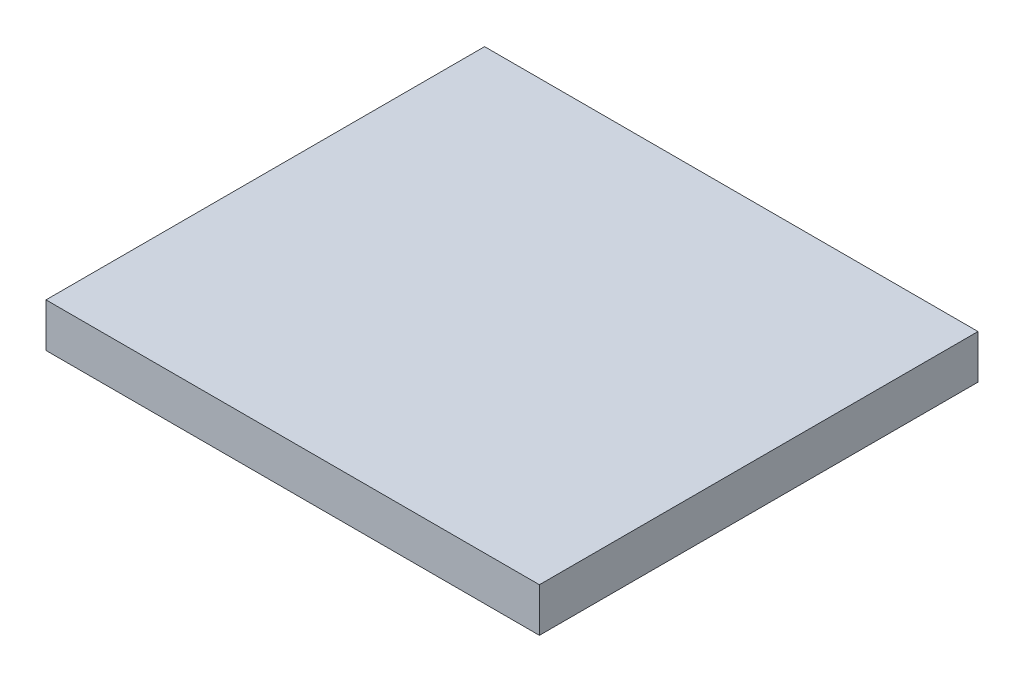
ISO-10303-21;
HEADER;
FILE_DESCRIPTION(('STEP AP214'),'2;1');
FILE_NAME('part.step','',(''),(''),'','','');
FILE_SCHEMA(('AUTOMOTIVE_DESIGN { 1 0 10303 214 1 1 1 1 }'));
ENDSEC;
DATA;
#1=APPLICATION_CONTEXT('core data for automotive mechanical design processes');
#2=APPLICATION_PROTOCOL_DEFINITION('international standard','automotive_design',2000,#1);
#3=PRODUCT_CONTEXT('',#1,'mechanical');
#4=PRODUCT('Part','Part','',(#3));
#5=PRODUCT_RELATED_PRODUCT_CATEGORY('part','',(#4));
#6=PRODUCT_DEFINITION_FORMATION('','',#4);
#7=PRODUCT_DEFINITION_CONTEXT('part definition',#1,'design');
#8=PRODUCT_DEFINITION('design','',#6,#7);
#9=PRODUCT_DEFINITION_SHAPE('','',#8);
#10=(LENGTH_UNIT() NAMED_UNIT(*) SI_UNIT(.MILLI.,.METRE.));
#11=(NAMED_UNIT(*) PLANE_ANGLE_UNIT() SI_UNIT($,.RADIAN.));
#12=(NAMED_UNIT(*) SI_UNIT($,.STERADIAN.) SOLID_ANGLE_UNIT());
#13=UNCERTAINTY_MEASURE_WITH_UNIT(LENGTH_MEASURE(1.E-05),#10,'distance_accuracy_value','');
#14=(GEOMETRIC_REPRESENTATION_CONTEXT(3) GLOBAL_UNCERTAINTY_ASSIGNED_CONTEXT((#13)) GLOBAL_UNIT_ASSIGNED_CONTEXT((#10,
#11,#12)) REPRESENTATION_CONTEXT('',''));
#15=CARTESIAN_POINT('',(0.,0.,0.));
#16=DIRECTION('',(0.,0.,1.));
#17=DIRECTION('',(1.,0.,0.));
#18=AXIS2_PLACEMENT_3D('',#15,#16,#17);
#19=CARTESIAN_POINT('',(0.,0.,0.));
#20=DIRECTION('',(0.,-1.,0.));
#21=DIRECTION('',(0.,0.,-1.));
#22=AXIS2_PLACEMENT_3D('',#19,#20,#21);
#23=PLANE('',#22);
#24=DIRECTION('',(0.,0.,-1.));
#25=VECTOR('',#24,1.);
#26=CARTESIAN_POINT('',(9.,0.,8.));
#27=LINE('',#26,#25);
#28=CARTESIAN_POINT('',(9.,0.,8.));
#29=VERTEX_POINT('',#28);
#30=CARTESIAN_POINT('',(9.,0.,-8.));
#31=VERTEX_POINT('',#30);
#32=EDGE_CURVE('E97',#29,#31,#27,.T.);
#33=ORIENTED_EDGE('',*,*,#32,.F.);
#34=DIRECTION('',(1.,0.,0.));
#35=VECTOR('',#34,1.);
#36=CARTESIAN_POINT('',(-9.,0.,8.));
#37=LINE('',#36,#35);
#38=CARTESIAN_POINT('',(-9.,0.,8.));
#39=VERTEX_POINT('',#38);
#40=EDGE_CURVE('E28',#39,#29,#37,.T.);
#41=ORIENTED_EDGE('',*,*,#40,.F.);
#42=DIRECTION('',(0.,0.,1.));
#43=VECTOR('',#42,1.);
#44=CARTESIAN_POINT('',(-9.,0.,8.));
#45=LINE('',#44,#43);
#46=CARTESIAN_POINT('',(-9.,0.,-8.));
#47=VERTEX_POINT('',#46);
#48=EDGE_CURVE('E67',#47,#39,#45,.T.);
#49=ORIENTED_EDGE('',*,*,#48,.F.);
#50=DIRECTION('',(-1.,0.,0.));
#51=VECTOR('',#50,1.);
#52=CARTESIAN_POINT('',(-9.,0.,-8.));
#53=LINE('',#52,#51);
#54=EDGE_CURVE('E87',#31,#47,#53,.T.);
#55=ORIENTED_EDGE('',*,*,#54,.F.);
#56=EDGE_LOOP('',(#33,#41,#49,#55));
#57=FACE_BOUND('',#56,.T.);
#58=ADVANCED_FACE('F17',(#57),#23,.T.);
#59=CARTESIAN_POINT('',(0.,1.6,0.));
#60=DIRECTION('',(0.,-1.,0.));
#61=DIRECTION('',(0.,0.,-1.));
#62=AXIS2_PLACEMENT_3D('',#59,#60,#61);
#63=PLANE('',#62);
#64=DIRECTION('',(0.,0.,-1.));
#65=VECTOR('',#64,1.);
#66=CARTESIAN_POINT('',(9.,1.6,8.));
#67=LINE('',#66,#65);
#68=CARTESIAN_POINT('',(9.,1.6,8.));
#69=VERTEX_POINT('',#68);
#70=CARTESIAN_POINT('',(9.,1.6,-8.));
#71=VERTEX_POINT('',#70);
#72=EDGE_CURVE('E76',#69,#71,#67,.T.);
#73=ORIENTED_EDGE('',*,*,#72,.T.);
#74=DIRECTION('',(-1.,0.,0.));
#75=VECTOR('',#74,1.);
#76=CARTESIAN_POINT('',(-9.,1.6,-8.));
#77=LINE('',#76,#75);
#78=CARTESIAN_POINT('',(-9.,1.6,-8.));
#79=VERTEX_POINT('',#78);
#80=EDGE_CURVE('E21',#71,#79,#77,.T.);
#81=ORIENTED_EDGE('',*,*,#80,.T.);
#82=DIRECTION('',(0.,0.,1.));
#83=VECTOR('',#82,1.);
#84=CARTESIAN_POINT('',(-9.,1.6,8.));
#85=LINE('',#84,#83);
#86=CARTESIAN_POINT('',(-9.,1.6,8.));
#87=VERTEX_POINT('',#86);
#88=EDGE_CURVE('E78',#79,#87,#85,.T.);
#89=ORIENTED_EDGE('',*,*,#88,.T.);
#90=DIRECTION('',(1.,0.,0.));
#91=VECTOR('',#90,1.);
#92=CARTESIAN_POINT('',(-9.,1.6,8.));
#93=LINE('',#92,#91);
#94=EDGE_CURVE('E11',#87,#69,#93,.T.);
#95=ORIENTED_EDGE('',*,*,#94,.T.);
#96=EDGE_LOOP('',(#73,#81,#89,#95));
#97=FACE_BOUND('',#96,.T.);
#98=ADVANCED_FACE('F73',(#97),#63,.F.);
#99=CARTESIAN_POINT('',(-9.,1.6,8.));
#100=DIRECTION('',(0.,0.,-1.));
#101=DIRECTION('',(0.,-1.,0.));
#102=AXIS2_PLACEMENT_3D('',#99,#100,#101);
#103=PLANE('',#102);
#104=ORIENTED_EDGE('',*,*,#40,.T.);
#105=DIRECTION('',(0.,-1.,0.));
#106=VECTOR('',#105,1.);
#107=CARTESIAN_POINT('',(9.,1.6,8.));
#108=LINE('',#107,#106);
#109=EDGE_CURVE('E81',#69,#29,#108,.T.);
#110=ORIENTED_EDGE('',*,*,#109,.F.);
#111=ORIENTED_EDGE('',*,*,#94,.F.);
#112=DIRECTION('',(0.,-1.,0.));
#113=VECTOR('',#112,1.);
#114=CARTESIAN_POINT('',(-9.,1.6,8.));
#115=LINE('',#114,#113);
#116=EDGE_CURVE('E101',#87,#39,#115,.T.);
#117=ORIENTED_EDGE('',*,*,#116,.T.);
#118=EDGE_LOOP('',(#104,#110,#111,#117));
#119=FACE_BOUND('',#118,.T.);
#120=ADVANCED_FACE('F82',(#119),#103,.F.);
#121=CARTESIAN_POINT('',(-9.,1.6,8.));
#122=DIRECTION('',(1.,0.,0.));
#123=DIRECTION('',(0.,1.,0.));
#124=AXIS2_PLACEMENT_3D('',#121,#122,#123);
#125=PLANE('',#124);
#126=ORIENTED_EDGE('',*,*,#48,.T.);
#127=ORIENTED_EDGE('',*,*,#116,.F.);
#128=ORIENTED_EDGE('',*,*,#88,.F.);
#129=DIRECTION('',(0.,-1.,0.));
#130=VECTOR('',#129,1.);
#131=CARTESIAN_POINT('',(-9.,1.6,-8.));
#132=LINE('',#131,#130);
#133=EDGE_CURVE('E104',#79,#47,#132,.T.);
#134=ORIENTED_EDGE('',*,*,#133,.T.);
#135=EDGE_LOOP('',(#126,#127,#128,#134));
#136=FACE_BOUND('',#135,.T.);
#137=ADVANCED_FACE('F19',(#136),#125,.F.);
#138=CARTESIAN_POINT('',(-9.,1.6,-8.));
#139=DIRECTION('',(0.,0.,1.));
#140=DIRECTION('',(1.,0.,0.));
#141=AXIS2_PLACEMENT_3D('',#138,#139,#140);
#142=PLANE('',#141);
#143=ORIENTED_EDGE('',*,*,#54,.T.);
#144=ORIENTED_EDGE('',*,*,#133,.F.);
#145=ORIENTED_EDGE('',*,*,#80,.F.);
#146=DIRECTION('',(0.,-1.,0.));
#147=VECTOR('',#146,1.);
#148=CARTESIAN_POINT('',(9.,1.6,-8.));
#149=LINE('',#148,#147);
#150=EDGE_CURVE('E91',#71,#31,#149,.T.);
#151=ORIENTED_EDGE('',*,*,#150,.T.);
#152=EDGE_LOOP('',(#143,#144,#145,#151));
#153=FACE_BOUND('',#152,.T.);
#154=ADVANCED_FACE('F121',(#153),#142,.F.);
#155=CARTESIAN_POINT('',(9.,1.6,8.));
#156=DIRECTION('',(-1.,0.,0.));
#157=DIRECTION('',(0.,0.,1.));
#158=AXIS2_PLACEMENT_3D('',#155,#156,#157);
#159=PLANE('',#158);
#160=ORIENTED_EDGE('',*,*,#32,.T.);
#161=ORIENTED_EDGE('',*,*,#150,.F.);
#162=ORIENTED_EDGE('',*,*,#72,.F.);
#163=ORIENTED_EDGE('',*,*,#109,.T.);
#164=EDGE_LOOP('',(#160,#161,#162,#163));
#165=FACE_BOUND('',#164,.T.);
#166=ADVANCED_FACE('F89',(#165),#159,.F.);
#167=CLOSED_SHELL('',(#58,#98,#120,#137,#154,#166));
#168=MANIFOLD_SOLID_BREP('B1',#167);
#169=ADVANCED_BREP_SHAPE_REPRESENTATION('',(#18,#168),#14);
#170=SHAPE_DEFINITION_REPRESENTATION(#9,#169);
ENDSEC;
END-ISO-10303-21;
